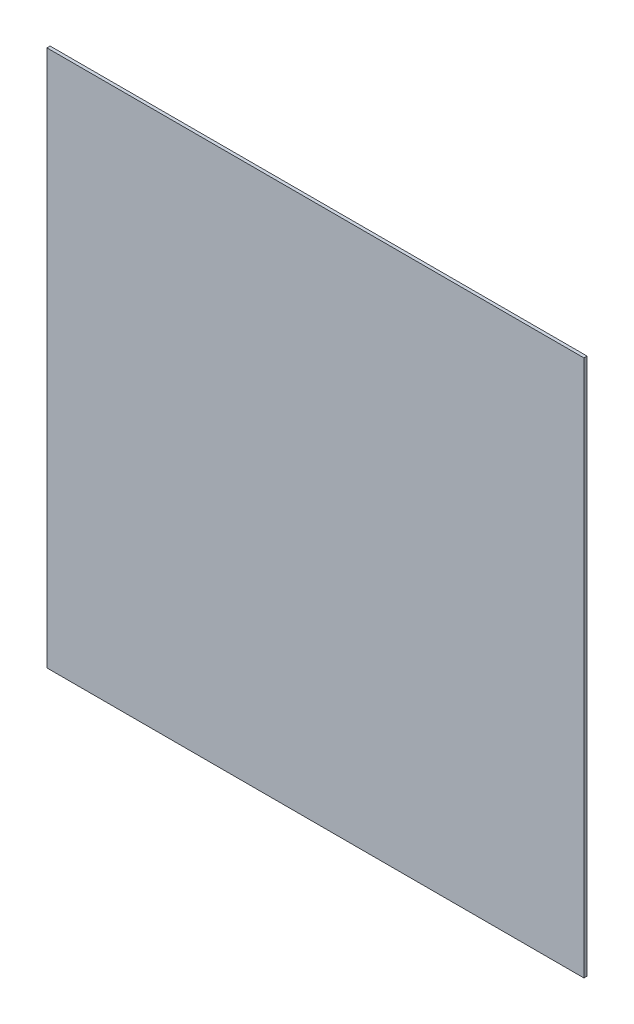
ISO-10303-21;
HEADER;
FILE_DESCRIPTION(('STEP AP214'),'2;1');
FILE_NAME('part.step','',(''),(''),'','','');
FILE_SCHEMA(('AUTOMOTIVE_DESIGN { 1 0 10303 214 1 1 1 1 }'));
ENDSEC;
DATA;
#1=APPLICATION_CONTEXT('core data for automotive mechanical design processes');
#2=APPLICATION_PROTOCOL_DEFINITION('international standard','automotive_design',2000,#1);
#3=PRODUCT_CONTEXT('',#1,'mechanical');
#4=PRODUCT('Part','Part','',(#3));
#5=PRODUCT_RELATED_PRODUCT_CATEGORY('part','',(#4));
#6=PRODUCT_DEFINITION_FORMATION('','',#4);
#7=PRODUCT_DEFINITION_CONTEXT('part definition',#1,'design');
#8=PRODUCT_DEFINITION('design','',#6,#7);
#9=PRODUCT_DEFINITION_SHAPE('','',#8);
#10=(LENGTH_UNIT() NAMED_UNIT(*) SI_UNIT(.MILLI.,.METRE.));
#11=(NAMED_UNIT(*) PLANE_ANGLE_UNIT() SI_UNIT($,.RADIAN.));
#12=(NAMED_UNIT(*) SI_UNIT($,.STERADIAN.) SOLID_ANGLE_UNIT());
#13=UNCERTAINTY_MEASURE_WITH_UNIT(LENGTH_MEASURE(1.E-05),#10,'distance_accuracy_value','');
#14=(GEOMETRIC_REPRESENTATION_CONTEXT(3) GLOBAL_UNCERTAINTY_ASSIGNED_CONTEXT((#13)) GLOBAL_UNIT_ASSIGNED_CONTEXT((#10,
#11,#12)) REPRESENTATION_CONTEXT('',''));
#15=CARTESIAN_POINT('',(0.,0.,0.));
#16=DIRECTION('',(0.,0.,1.));
#17=DIRECTION('',(1.,0.,0.));
#18=AXIS2_PLACEMENT_3D('',#15,#16,#17);
#19=CARTESIAN_POINT('',(-255.,-255.,3.));
#20=DIRECTION('',(1.,0.,0.));
#21=DIRECTION('',(0.,0.,-1.));
#22=AXIS2_PLACEMENT_3D('',#19,#20,#21);
#23=PLANE('',#22);
#24=DIRECTION('',(0.,-1.,0.));
#25=VECTOR('',#24,1.);
#26=CARTESIAN_POINT('',(-255.,-255.,0.));
#27=LINE('',#26,#25);
#28=CARTESIAN_POINT('',(-255.,255.,0.));
#29=VERTEX_POINT('',#28);
#30=CARTESIAN_POINT('',(-255.,-255.,0.));
#31=VERTEX_POINT('',#30);
#32=EDGE_CURVE('E105',#29,#31,#27,.T.);
#33=ORIENTED_EDGE('',*,*,#32,.T.);
#34=DIRECTION('',(0.,0.,-1.));
#35=VECTOR('',#34,1.);
#36=CARTESIAN_POINT('',(-255.,-255.,3.));
#37=LINE('',#36,#35);
#38=CARTESIAN_POINT('',(-255.,-255.,3.));
#39=VERTEX_POINT('',#38);
#40=EDGE_CURVE('E11',#39,#31,#37,.T.);
#41=ORIENTED_EDGE('',*,*,#40,.F.);
#42=DIRECTION('',(0.,-1.,0.));
#43=VECTOR('',#42,1.);
#44=CARTESIAN_POINT('',(-255.,-255.,3.));
#45=LINE('',#44,#43);
#46=CARTESIAN_POINT('',(-255.,255.,3.));
#47=VERTEX_POINT('',#46);
#48=EDGE_CURVE('E89',#47,#39,#45,.T.);
#49=ORIENTED_EDGE('',*,*,#48,.F.);
#50=DIRECTION('',(0.,0.,-1.));
#51=VECTOR('',#50,1.);
#52=CARTESIAN_POINT('',(-255.,255.,3.));
#53=LINE('',#52,#51);
#54=EDGE_CURVE('E101',#47,#29,#53,.T.);
#55=ORIENTED_EDGE('',*,*,#54,.T.);
#56=EDGE_LOOP('',(#33,#41,#49,#55));
#57=FACE_BOUND('',#56,.T.);
#58=ADVANCED_FACE('F37',(#57),#23,.F.);
#59=CARTESIAN_POINT('',(255.,-255.,3.));
#60=DIRECTION('',(0.,1.,0.));
#61=DIRECTION('',(-1.,0.,0.));
#62=AXIS2_PLACEMENT_3D('',#59,#60,#61);
#63=PLANE('',#62);
#64=DIRECTION('',(1.,0.,0.));
#65=VECTOR('',#64,1.);
#66=CARTESIAN_POINT('',(255.,-255.,0.));
#67=LINE('',#66,#65);
#68=CARTESIAN_POINT('',(255.,-255.,0.));
#69=VERTEX_POINT('',#68);
#70=EDGE_CURVE('E94',#31,#69,#67,.T.);
#71=ORIENTED_EDGE('',*,*,#70,.T.);
#72=DIRECTION('',(0.,0.,-1.));
#73=VECTOR('',#72,1.);
#74=CARTESIAN_POINT('',(255.,-255.,3.));
#75=LINE('',#74,#73);
#76=CARTESIAN_POINT('',(255.,-255.,3.));
#77=VERTEX_POINT('',#76);
#78=EDGE_CURVE('E46',#77,#69,#75,.T.);
#79=ORIENTED_EDGE('',*,*,#78,.F.);
#80=DIRECTION('',(1.,0.,0.));
#81=VECTOR('',#80,1.);
#82=CARTESIAN_POINT('',(255.,-255.,3.));
#83=LINE('',#82,#81);
#84=EDGE_CURVE('E84',#39,#77,#83,.T.);
#85=ORIENTED_EDGE('',*,*,#84,.F.);
#86=ORIENTED_EDGE('',*,*,#40,.T.);
#87=EDGE_LOOP('',(#71,#79,#85,#86));
#88=FACE_BOUND('',#87,.T.);
#89=ADVANCED_FACE('F93',(#88),#63,.F.);
#90=CARTESIAN_POINT('',(255.,-255.,3.));
#91=DIRECTION('',(-1.,0.,0.));
#92=DIRECTION('',(0.,0.,1.));
#93=AXIS2_PLACEMENT_3D('',#90,#91,#92);
#94=PLANE('',#93);
#95=DIRECTION('',(0.,1.,0.));
#96=VECTOR('',#95,1.);
#97=CARTESIAN_POINT('',(255.,-255.,0.));
#98=LINE('',#97,#96);
#99=CARTESIAN_POINT('',(255.,255.,0.));
#100=VERTEX_POINT('',#99);
#101=EDGE_CURVE('E71',#69,#100,#98,.T.);
#102=ORIENTED_EDGE('',*,*,#101,.T.);
#103=DIRECTION('',(0.,0.,-1.));
#104=VECTOR('',#103,1.);
#105=CARTESIAN_POINT('',(255.,255.,3.));
#106=LINE('',#105,#104);
#107=CARTESIAN_POINT('',(255.,255.,3.));
#108=VERTEX_POINT('',#107);
#109=EDGE_CURVE('E96',#108,#100,#106,.T.);
#110=ORIENTED_EDGE('',*,*,#109,.F.);
#111=DIRECTION('',(0.,1.,0.));
#112=VECTOR('',#111,1.);
#113=CARTESIAN_POINT('',(255.,-255.,3.));
#114=LINE('',#113,#112);
#115=EDGE_CURVE('E87',#77,#108,#114,.T.);
#116=ORIENTED_EDGE('',*,*,#115,.F.);
#117=ORIENTED_EDGE('',*,*,#78,.T.);
#118=EDGE_LOOP('',(#102,#110,#116,#117));
#119=FACE_BOUND('',#118,.T.);
#120=ADVANCED_FACE('F97',(#119),#94,.F.);
#121=CARTESIAN_POINT('',(255.,255.,3.));
#122=DIRECTION('',(0.,-1.,0.));
#123=DIRECTION('',(1.,0.,0.));
#124=AXIS2_PLACEMENT_3D('',#121,#122,#123);
#125=PLANE('',#124);
#126=DIRECTION('',(-1.,0.,0.));
#127=VECTOR('',#126,1.);
#128=CARTESIAN_POINT('',(255.,255.,0.));
#129=LINE('',#128,#127);
#130=EDGE_CURVE('E77',#100,#29,#129,.T.);
#131=ORIENTED_EDGE('',*,*,#130,.T.);
#132=ORIENTED_EDGE('',*,*,#54,.F.);
#133=DIRECTION('',(-1.,0.,0.));
#134=VECTOR('',#133,1.);
#135=CARTESIAN_POINT('',(255.,255.,3.));
#136=LINE('',#135,#134);
#137=EDGE_CURVE('E54',#108,#47,#136,.T.);
#138=ORIENTED_EDGE('',*,*,#137,.F.);
#139=ORIENTED_EDGE('',*,*,#109,.T.);
#140=EDGE_LOOP('',(#131,#132,#138,#139));
#141=FACE_BOUND('',#140,.T.);
#142=ADVANCED_FACE('F118',(#141),#125,.F.);
#143=CARTESIAN_POINT('',(0.,0.,3.));
#144=DIRECTION('',(0.,0.,1.));
#145=DIRECTION('',(1.,0.,0.));
#146=AXIS2_PLACEMENT_3D('',#143,#144,#145);
#147=PLANE('',#146);
#148=ORIENTED_EDGE('',*,*,#48,.T.);
#149=ORIENTED_EDGE('',*,*,#84,.T.);
#150=ORIENTED_EDGE('',*,*,#115,.T.);
#151=ORIENTED_EDGE('',*,*,#137,.T.);
#152=EDGE_LOOP('',(#148,#149,#150,#151));
#153=FACE_BOUND('',#152,.T.);
#154=ADVANCED_FACE('F85',(#153),#147,.T.);
#155=CARTESIAN_POINT('',(0.,0.,0.));
#156=DIRECTION('',(0.,0.,1.));
#157=DIRECTION('',(1.,0.,0.));
#158=AXIS2_PLACEMENT_3D('',#155,#156,#157);
#159=PLANE('',#158);
#160=ORIENTED_EDGE('',*,*,#32,.F.);
#161=ORIENTED_EDGE('',*,*,#130,.F.);
#162=ORIENTED_EDGE('',*,*,#101,.F.);
#163=ORIENTED_EDGE('',*,*,#70,.F.);
#164=EDGE_LOOP('',(#160,#161,#162,#163));
#165=FACE_BOUND('',#164,.T.);
#166=ADVANCED_FACE('F121',(#165),#159,.F.);
#167=CLOSED_SHELL('',(#58,#89,#120,#142,#154,#166));
#168=MANIFOLD_SOLID_BREP('B2',#167);
#169=ADVANCED_BREP_SHAPE_REPRESENTATION('',(#18,#168),#14);
#170=SHAPE_DEFINITION_REPRESENTATION(#9,#169);
ENDSEC;
END-ISO-10303-21;
